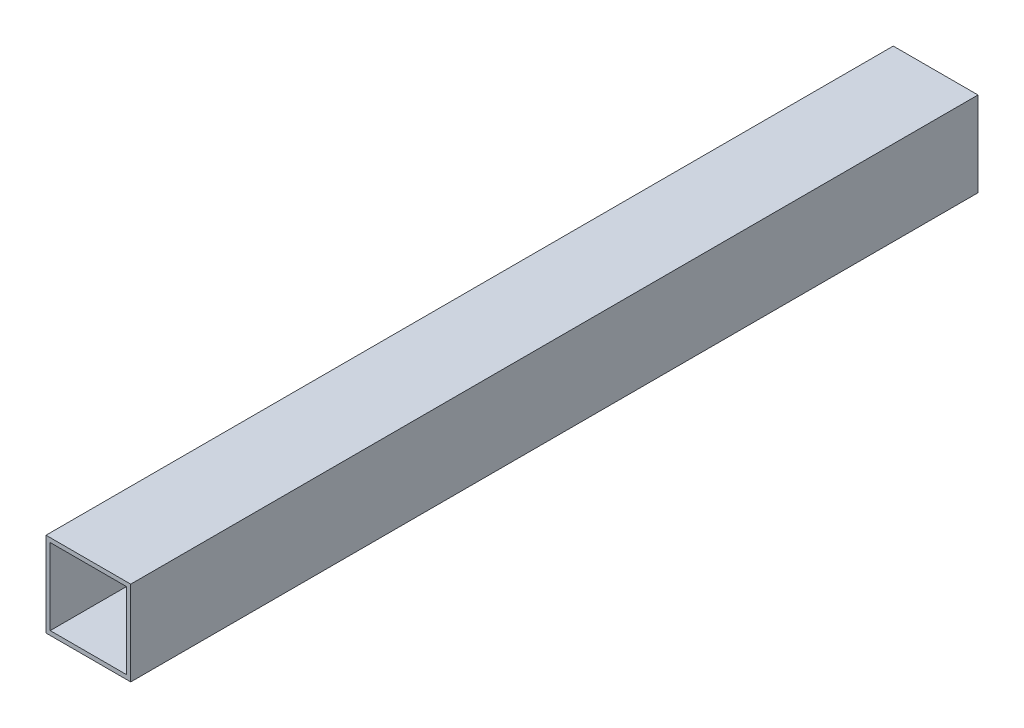
ISO-10303-21;
HEADER;
FILE_DESCRIPTION(('STEP AP214'),'2;1');
FILE_NAME('part.step','',(''),(''),'','','');
FILE_SCHEMA(('AUTOMOTIVE_DESIGN { 1 0 10303 214 1 1 1 1 }'));
ENDSEC;
DATA;
#1=APPLICATION_CONTEXT('core data for automotive mechanical design processes');
#2=APPLICATION_PROTOCOL_DEFINITION('international standard','automotive_design',2000,#1);
#3=PRODUCT_CONTEXT('',#1,'mechanical');
#4=PRODUCT('Part','Part','',(#3));
#5=PRODUCT_RELATED_PRODUCT_CATEGORY('part','',(#4));
#6=PRODUCT_DEFINITION_FORMATION('','',#4);
#7=PRODUCT_DEFINITION_CONTEXT('part definition',#1,'design');
#8=PRODUCT_DEFINITION('design','',#6,#7);
#9=PRODUCT_DEFINITION_SHAPE('','',#8);
#10=(LENGTH_UNIT() NAMED_UNIT(*) SI_UNIT(.MILLI.,.METRE.));
#11=(NAMED_UNIT(*) PLANE_ANGLE_UNIT() SI_UNIT($,.RADIAN.));
#12=(NAMED_UNIT(*) SI_UNIT($,.STERADIAN.) SOLID_ANGLE_UNIT());
#13=UNCERTAINTY_MEASURE_WITH_UNIT(LENGTH_MEASURE(1.E-05),#10,'distance_accuracy_value','');
#14=(GEOMETRIC_REPRESENTATION_CONTEXT(3) GLOBAL_UNCERTAINTY_ASSIGNED_CONTEXT((#13)) GLOBAL_UNIT_ASSIGNED_CONTEXT((#10,
#11,#12)) REPRESENTATION_CONTEXT('',''));
#15=CARTESIAN_POINT('',(0.,0.,0.));
#16=DIRECTION('',(0.,0.,1.));
#17=DIRECTION('',(1.,0.,0.));
#18=AXIS2_PLACEMENT_3D('',#15,#16,#17);
#19=CARTESIAN_POINT('',(0.,0.,500.));
#20=DIRECTION('',(0.,0.,-1.));
#21=DIRECTION('',(-1.,0.,0.));
#22=AXIS2_PLACEMENT_3D('',#19,#20,#21);
#23=PLANE('',#22);
#24=DIRECTION('',(0.,-1.,0.));
#25=VECTOR('',#24,1.);
#26=CARTESIAN_POINT('',(-50.,-50.,500.));
#27=LINE('',#26,#25);
#28=CARTESIAN_POINT('',(-50.,49.9999999999999,500.));
#29=VERTEX_POINT('',#28);
#30=CARTESIAN_POINT('',(-50.,-50.,500.));
#31=VERTEX_POINT('',#30);
#32=EDGE_CURVE('E133',#29,#31,#27,.T.);
#33=ORIENTED_EDGE('',*,*,#32,.T.);
#34=DIRECTION('',(1.,0.,0.));
#35=VECTOR('',#34,1.);
#36=CARTESIAN_POINT('',(-50.,-50.,500.));
#37=LINE('',#36,#35);
#38=CARTESIAN_POINT('',(50.,-50.,500.));
#39=VERTEX_POINT('',#38);
#40=EDGE_CURVE('E136',#31,#39,#37,.T.);
#41=ORIENTED_EDGE('',*,*,#40,.T.);
#42=DIRECTION('',(0.,1.,0.));
#43=VECTOR('',#42,1.);
#44=CARTESIAN_POINT('',(50.,-50.,500.));
#45=LINE('',#44,#43);
#46=CARTESIAN_POINT('',(49.9999999999999,49.9999999999999,500.));
#47=VERTEX_POINT('',#46);
#48=EDGE_CURVE('E139',#39,#47,#45,.T.);
#49=ORIENTED_EDGE('',*,*,#48,.T.);
#50=DIRECTION('',(-1.,0.,0.));
#51=VECTOR('',#50,1.);
#52=CARTESIAN_POINT('',(-50.,49.9999999999999,500.));
#53=LINE('',#52,#51);
#54=EDGE_CURVE('E141',#47,#29,#53,.T.);
#55=ORIENTED_EDGE('',*,*,#54,.T.);
#56=EDGE_LOOP('',(#33,#41,#49,#55));
#57=FACE_BOUND('',#56,.T.);
#58=DIRECTION('',(0.,-1.,0.));
#59=VECTOR('',#58,1.);
#60=CARTESIAN_POINT('',(-45.,-45.,500.));
#61=LINE('',#60,#59);
#62=CARTESIAN_POINT('',(-45.,44.9999999999999,500.));
#63=VERTEX_POINT('',#62);
#64=CARTESIAN_POINT('',(-45.,-45.,500.));
#65=VERTEX_POINT('',#64);
#66=EDGE_CURVE('E97',#63,#65,#61,.T.);
#67=ORIENTED_EDGE('',*,*,#66,.F.);
#68=DIRECTION('',(-1.,0.,0.));
#69=VECTOR('',#68,1.);
#70=CARTESIAN_POINT('',(-45.,44.9999999999999,500.));
#71=LINE('',#70,#69);
#72=CARTESIAN_POINT('',(45.,44.9999999999999,500.));
#73=VERTEX_POINT('',#72);
#74=EDGE_CURVE('E119',#73,#63,#71,.T.);
#75=ORIENTED_EDGE('',*,*,#74,.F.);
#76=DIRECTION('',(0.,1.,0.));
#77=VECTOR('',#76,1.);
#78=CARTESIAN_POINT('',(45.,-45.,500.));
#79=LINE('',#78,#77);
#80=CARTESIAN_POINT('',(45.,-45.,500.));
#81=VERTEX_POINT('',#80);
#82=EDGE_CURVE('E117',#81,#73,#79,.T.);
#83=ORIENTED_EDGE('',*,*,#82,.F.);
#84=DIRECTION('',(1.,0.,0.));
#85=VECTOR('',#84,1.);
#86=CARTESIAN_POINT('',(-45.,-45.,500.));
#87=LINE('',#86,#85);
#88=EDGE_CURVE('E105',#65,#81,#87,.T.);
#89=ORIENTED_EDGE('',*,*,#88,.F.);
#90=EDGE_LOOP('',(#67,#75,#83,#89));
#91=FACE_BOUND('',#90,.T.);
#92=ADVANCED_FACE('F32',(#57,#91),#23,.F.);
#93=CARTESIAN_POINT('',(0.,0.,-500.));
#94=DIRECTION('',(0.,0.,-1.));
#95=DIRECTION('',(-1.,0.,0.));
#96=AXIS2_PLACEMENT_3D('',#93,#94,#95);
#97=PLANE('',#96);
#98=DIRECTION('',(0.,-1.,0.));
#99=VECTOR('',#98,1.);
#100=CARTESIAN_POINT('',(-50.,-50.,-500.));
#101=LINE('',#100,#99);
#102=CARTESIAN_POINT('',(-50.,49.9999999999999,-500.));
#103=VERTEX_POINT('',#102);
#104=CARTESIAN_POINT('',(-50.,-50.,-500.));
#105=VERTEX_POINT('',#104);
#106=EDGE_CURVE('E113',#103,#105,#101,.T.);
#107=ORIENTED_EDGE('',*,*,#106,.F.);
#108=DIRECTION('',(-1.,0.,0.));
#109=VECTOR('',#108,1.);
#110=CARTESIAN_POINT('',(-50.,49.9999999999999,-500.));
#111=LINE('',#110,#109);
#112=CARTESIAN_POINT('',(49.9999999999999,49.9999999999999,-500.));
#113=VERTEX_POINT('',#112);
#114=EDGE_CURVE('E137',#113,#103,#111,.T.);
#115=ORIENTED_EDGE('',*,*,#114,.F.);
#116=DIRECTION('',(0.,1.,0.));
#117=VECTOR('',#116,1.);
#118=CARTESIAN_POINT('',(50.,-50.,-500.));
#119=LINE('',#118,#117);
#120=CARTESIAN_POINT('',(50.,-50.,-500.));
#121=VERTEX_POINT('',#120);
#122=EDGE_CURVE('E148',#121,#113,#119,.T.);
#123=ORIENTED_EDGE('',*,*,#122,.F.);
#124=DIRECTION('',(1.,0.,0.));
#125=VECTOR('',#124,1.);
#126=CARTESIAN_POINT('',(-50.,-50.,-500.));
#127=LINE('',#126,#125);
#128=EDGE_CURVE('E146',#105,#121,#127,.T.);
#129=ORIENTED_EDGE('',*,*,#128,.F.);
#130=EDGE_LOOP('',(#107,#115,#123,#129));
#131=FACE_BOUND('',#130,.T.);
#132=DIRECTION('',(-1.,0.,0.));
#133=VECTOR('',#132,1.);
#134=CARTESIAN_POINT('',(-45.,44.9999999999999,-500.));
#135=LINE('',#134,#133);
#136=CARTESIAN_POINT('',(45.,44.9999999999999,-500.));
#137=VERTEX_POINT('',#136);
#138=CARTESIAN_POINT('',(-45.,44.9999999999999,-500.));
#139=VERTEX_POINT('',#138);
#140=EDGE_CURVE('E106',#137,#139,#135,.T.);
#141=ORIENTED_EDGE('',*,*,#140,.T.);
#142=DIRECTION('',(0.,-1.,0.));
#143=VECTOR('',#142,1.);
#144=CARTESIAN_POINT('',(-45.,-45.,-500.));
#145=LINE('',#144,#143);
#146=CARTESIAN_POINT('',(-45.,-45.,-500.));
#147=VERTEX_POINT('',#146);
#148=EDGE_CURVE('E55',#139,#147,#145,.T.);
#149=ORIENTED_EDGE('',*,*,#148,.T.);
#150=DIRECTION('',(1.,0.,0.));
#151=VECTOR('',#150,1.);
#152=CARTESIAN_POINT('',(-45.,-45.,-500.));
#153=LINE('',#152,#151);
#154=CARTESIAN_POINT('',(45.,-45.,-500.));
#155=VERTEX_POINT('',#154);
#156=EDGE_CURVE('E112',#147,#155,#153,.T.);
#157=ORIENTED_EDGE('',*,*,#156,.T.);
#158=DIRECTION('',(0.,1.,0.));
#159=VECTOR('',#158,1.);
#160=CARTESIAN_POINT('',(45.,-45.,-500.));
#161=LINE('',#160,#159);
#162=EDGE_CURVE('E125',#155,#137,#161,.T.);
#163=ORIENTED_EDGE('',*,*,#162,.T.);
#164=EDGE_LOOP('',(#141,#149,#157,#163));
#165=FACE_BOUND('',#164,.T.);
#166=ADVANCED_FACE('F166',(#131,#165),#97,.T.);
#167=CARTESIAN_POINT('',(-50.,-50.,500.));
#168=DIRECTION('',(1.,0.,0.));
#169=DIRECTION('',(0.,0.,-1.));
#170=AXIS2_PLACEMENT_3D('',#167,#168,#169);
#171=PLANE('',#170);
#172=ORIENTED_EDGE('',*,*,#106,.T.);
#173=DIRECTION('',(0.,0.,-1.));
#174=VECTOR('',#173,1.);
#175=CARTESIAN_POINT('',(-50.,-50.,500.));
#176=LINE('',#175,#174);
#177=EDGE_CURVE('E11',#31,#105,#176,.T.);
#178=ORIENTED_EDGE('',*,*,#177,.F.);
#179=ORIENTED_EDGE('',*,*,#32,.F.);
#180=DIRECTION('',(0.,0.,-1.));
#181=VECTOR('',#180,1.);
#182=CARTESIAN_POINT('',(-50.,49.9999999999999,500.));
#183=LINE('',#182,#181);
#184=EDGE_CURVE('E143',#29,#103,#183,.T.);
#185=ORIENTED_EDGE('',*,*,#184,.T.);
#186=EDGE_LOOP('',(#172,#178,#179,#185));
#187=FACE_BOUND('',#186,.T.);
#188=ADVANCED_FACE('F34',(#187),#171,.F.);
#189=CARTESIAN_POINT('',(-50.,-50.,500.));
#190=DIRECTION('',(0.,1.,0.));
#191=DIRECTION('',(0.,0.,1.));
#192=AXIS2_PLACEMENT_3D('',#189,#190,#191);
#193=PLANE('',#192);
#194=ORIENTED_EDGE('',*,*,#128,.T.);
#195=DIRECTION('',(0.,0.,-1.));
#196=VECTOR('',#195,1.);
#197=CARTESIAN_POINT('',(50.,-50.,500.));
#198=LINE('',#197,#196);
#199=EDGE_CURVE('E40',#39,#121,#198,.T.);
#200=ORIENTED_EDGE('',*,*,#199,.F.);
#201=ORIENTED_EDGE('',*,*,#40,.F.);
#202=ORIENTED_EDGE('',*,*,#177,.T.);
#203=EDGE_LOOP('',(#194,#200,#201,#202));
#204=FACE_BOUND('',#203,.T.);
#205=ADVANCED_FACE('F176',(#204),#193,.F.);
#206=CARTESIAN_POINT('',(50.,-50.,500.));
#207=DIRECTION('',(-1.,0.,0.));
#208=DIRECTION('',(0.,-1.,0.));
#209=AXIS2_PLACEMENT_3D('',#206,#207,#208);
#210=PLANE('',#209);
#211=ORIENTED_EDGE('',*,*,#122,.T.);
#212=DIRECTION('',(0.,0.,-1.));
#213=VECTOR('',#212,1.);
#214=CARTESIAN_POINT('',(49.9999999999999,49.9999999999999,500.));
#215=LINE('',#214,#213);
#216=EDGE_CURVE('E153',#47,#113,#215,.T.);
#217=ORIENTED_EDGE('',*,*,#216,.F.);
#218=ORIENTED_EDGE('',*,*,#48,.F.);
#219=ORIENTED_EDGE('',*,*,#199,.T.);
#220=EDGE_LOOP('',(#211,#217,#218,#219));
#221=FACE_BOUND('',#220,.T.);
#222=ADVANCED_FACE('F160',(#221),#210,.F.);
#223=CARTESIAN_POINT('',(-50.,49.9999999999999,500.));
#224=DIRECTION('',(0.,-1.,0.));
#225=DIRECTION('',(0.,0.,-1.));
#226=AXIS2_PLACEMENT_3D('',#223,#224,#225);
#227=PLANE('',#226);
#228=ORIENTED_EDGE('',*,*,#114,.T.);
#229=ORIENTED_EDGE('',*,*,#184,.F.);
#230=ORIENTED_EDGE('',*,*,#54,.F.);
#231=ORIENTED_EDGE('',*,*,#216,.T.);
#232=EDGE_LOOP('',(#228,#229,#230,#231));
#233=FACE_BOUND('',#232,.T.);
#234=ADVANCED_FACE('F170',(#233),#227,.F.);
#235=CARTESIAN_POINT('',(-45.,-45.,500.));
#236=DIRECTION('',(1.,0.,0.));
#237=DIRECTION('',(0.,0.,-1.));
#238=AXIS2_PLACEMENT_3D('',#235,#236,#237);
#239=PLANE('',#238);
#240=ORIENTED_EDGE('',*,*,#148,.F.);
#241=DIRECTION('',(0.,0.,-1.));
#242=VECTOR('',#241,1.);
#243=CARTESIAN_POINT('',(-45.,44.9999999999999,500.));
#244=LINE('',#243,#242);
#245=EDGE_CURVE('E101',#63,#139,#244,.T.);
#246=ORIENTED_EDGE('',*,*,#245,.F.);
#247=ORIENTED_EDGE('',*,*,#66,.T.);
#248=DIRECTION('',(0.,0.,-1.));
#249=VECTOR('',#248,1.);
#250=CARTESIAN_POINT('',(-45.,-45.,500.));
#251=LINE('',#250,#249);
#252=EDGE_CURVE('E100',#65,#147,#251,.T.);
#253=ORIENTED_EDGE('',*,*,#252,.T.);
#254=EDGE_LOOP('',(#240,#246,#247,#253));
#255=FACE_BOUND('',#254,.T.);
#256=ADVANCED_FACE('F99',(#255),#239,.T.);
#257=CARTESIAN_POINT('',(-45.,-45.,500.));
#258=DIRECTION('',(0.,1.,0.));
#259=DIRECTION('',(0.,0.,1.));
#260=AXIS2_PLACEMENT_3D('',#257,#258,#259);
#261=PLANE('',#260);
#262=ORIENTED_EDGE('',*,*,#156,.F.);
#263=ORIENTED_EDGE('',*,*,#252,.F.);
#264=ORIENTED_EDGE('',*,*,#88,.T.);
#265=DIRECTION('',(0.,0.,-1.));
#266=VECTOR('',#265,1.);
#267=CARTESIAN_POINT('',(45.,-45.,500.));
#268=LINE('',#267,#266);
#269=EDGE_CURVE('E114',#81,#155,#268,.T.);
#270=ORIENTED_EDGE('',*,*,#269,.T.);
#271=EDGE_LOOP('',(#262,#263,#264,#270));
#272=FACE_BOUND('',#271,.T.);
#273=ADVANCED_FACE('F109',(#272),#261,.T.);
#274=CARTESIAN_POINT('',(45.,-45.,500.));
#275=DIRECTION('',(-1.,0.,0.));
#276=DIRECTION('',(0.,-1.,0.));
#277=AXIS2_PLACEMENT_3D('',#274,#275,#276);
#278=PLANE('',#277);
#279=ORIENTED_EDGE('',*,*,#162,.F.);
#280=ORIENTED_EDGE('',*,*,#269,.F.);
#281=ORIENTED_EDGE('',*,*,#82,.T.);
#282=DIRECTION('',(0.,0.,-1.));
#283=VECTOR('',#282,1.);
#284=CARTESIAN_POINT('',(45.,44.9999999999999,500.));
#285=LINE('',#284,#283);
#286=EDGE_CURVE('E47',#73,#137,#285,.T.);
#287=ORIENTED_EDGE('',*,*,#286,.T.);
#288=EDGE_LOOP('',(#279,#280,#281,#287));
#289=FACE_BOUND('',#288,.T.);
#290=ADVANCED_FACE('F199',(#289),#278,.T.);
#291=CARTESIAN_POINT('',(-45.,44.9999999999999,500.));
#292=DIRECTION('',(0.,-1.,0.));
#293=DIRECTION('',(0.,0.,-1.));
#294=AXIS2_PLACEMENT_3D('',#291,#292,#293);
#295=PLANE('',#294);
#296=ORIENTED_EDGE('',*,*,#140,.F.);
#297=ORIENTED_EDGE('',*,*,#286,.F.);
#298=ORIENTED_EDGE('',*,*,#74,.T.);
#299=ORIENTED_EDGE('',*,*,#245,.T.);
#300=EDGE_LOOP('',(#296,#297,#298,#299));
#301=FACE_BOUND('',#300,.T.);
#302=ADVANCED_FACE('F203',(#301),#295,.T.);
#303=CLOSED_SHELL('',(#92,#166,#188,#205,#222,#234,#256,#273,#290,#302));
#304=MANIFOLD_SOLID_BREP('B2',#303);
#305=ADVANCED_BREP_SHAPE_REPRESENTATION('',(#18,#304),#14);
#306=SHAPE_DEFINITION_REPRESENTATION(#9,#305);
ENDSEC;
END-ISO-10303-21;
